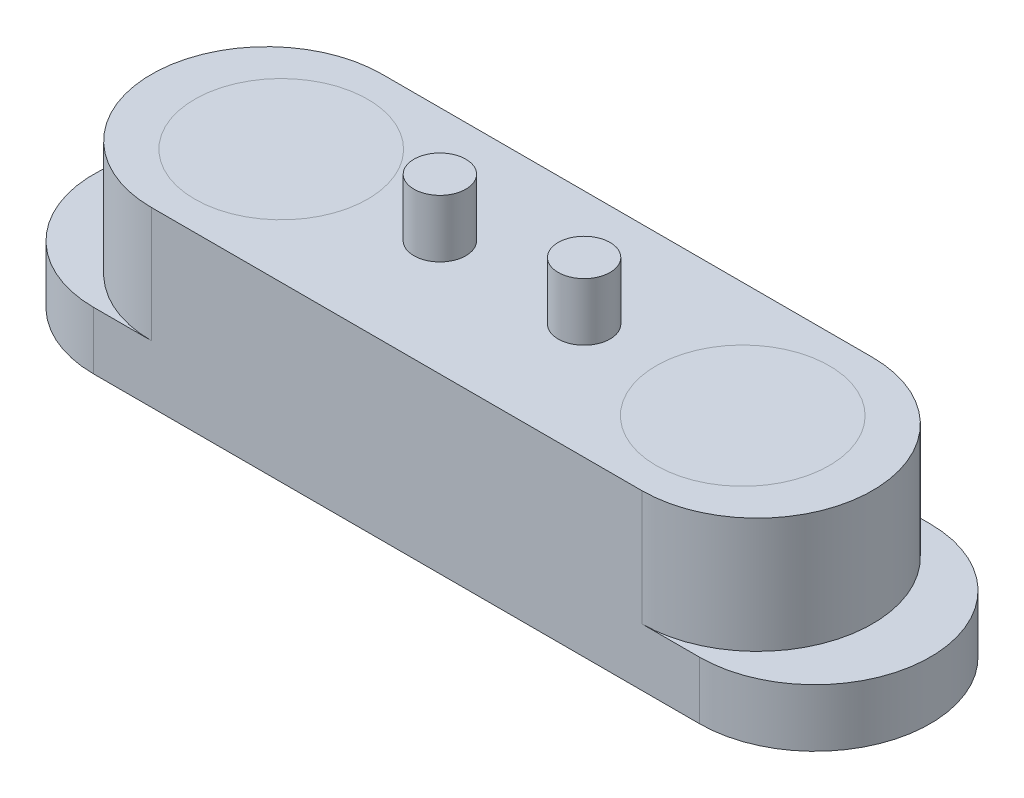
ISO-10303-21;
HEADER;
FILE_DESCRIPTION(('STEP AP214'),'2;1');
FILE_NAME('part.step','',(''),(''),'','','');
FILE_SCHEMA(('AUTOMOTIVE_DESIGN { 1 0 10303 214 1 1 1 1 }'));
ENDSEC;
DATA;
#1=APPLICATION_CONTEXT('core data for automotive mechanical design processes');
#2=APPLICATION_PROTOCOL_DEFINITION('international standard','automotive_design',2000,#1);
#3=PRODUCT_CONTEXT('',#1,'mechanical');
#4=PRODUCT('Part','Part','',(#3));
#5=PRODUCT_RELATED_PRODUCT_CATEGORY('part','',(#4));
#6=PRODUCT_DEFINITION_FORMATION('','',#4);
#7=PRODUCT_DEFINITION_CONTEXT('part definition',#1,'design');
#8=PRODUCT_DEFINITION('design','',#6,#7);
#9=PRODUCT_DEFINITION_SHAPE('','',#8);
#10=(LENGTH_UNIT() NAMED_UNIT(*) SI_UNIT(.MILLI.,.METRE.));
#11=(NAMED_UNIT(*) PLANE_ANGLE_UNIT() SI_UNIT($,.RADIAN.));
#12=(NAMED_UNIT(*) SI_UNIT($,.STERADIAN.) SOLID_ANGLE_UNIT());
#13=UNCERTAINTY_MEASURE_WITH_UNIT(LENGTH_MEASURE(1.E-05),#10,'distance_accuracy_value','');
#14=(GEOMETRIC_REPRESENTATION_CONTEXT(3) GLOBAL_UNCERTAINTY_ASSIGNED_CONTEXT((#13)) GLOBAL_UNIT_ASSIGNED_CONTEXT((#10,
#11,#12)) REPRESENTATION_CONTEXT('',''));
#15=CARTESIAN_POINT('',(0.,0.,0.));
#16=DIRECTION('',(0.,0.,1.));
#17=DIRECTION('',(1.,0.,0.));
#18=AXIS2_PLACEMENT_3D('',#15,#16,#17);
#19=CARTESIAN_POINT('',(9.25,7.24264068711929,0.));
#20=DIRECTION('',(0.,-1.,0.));
#21=DIRECTION('',(0.,0.,-1.));
#22=AXIS2_PLACEMENT_3D('',#19,#20,#21);
#23=CYLINDRICAL_SURFACE('',#22,1.5);
#24=CARTESIAN_POINT('',(9.25,2.,0.));
#25=DIRECTION('',(0.,1.,0.));
#26=DIRECTION('',(0.,0.,1.));
#27=AXIS2_PLACEMENT_3D('',#24,#25,#26);
#28=CIRCLE('',#27,1.5);
#29=CARTESIAN_POINT('',(9.25,2.,1.5));
#30=VERTEX_POINT('',#29);
#31=EDGE_CURVE('E11',#30,#30,#28,.T.);
#32=ORIENTED_EDGE('',*,*,#31,.T.);
#33=EDGE_LOOP('',(#32));
#34=FACE_BOUND('',#33,.T.);
#35=CARTESIAN_POINT('',(9.25,3.,0.));
#36=DIRECTION('',(0.,1.,0.));
#37=DIRECTION('',(0.,0.,1.));
#38=AXIS2_PLACEMENT_3D('',#35,#36,#37);
#39=CIRCLE('',#38,1.5);
#40=CARTESIAN_POINT('',(9.25,3.,1.5));
#41=VERTEX_POINT('',#40);
#42=EDGE_CURVE('E58',#41,#41,#39,.T.);
#43=ORIENTED_EDGE('',*,*,#42,.F.);
#44=EDGE_LOOP('',(#43));
#45=FACE_BOUND('',#44,.T.);
#46=ADVANCED_FACE('F51',(#34,#45),#23,.T.);
#47=CARTESIAN_POINT('',(9.25,2.,0.));
#48=DIRECTION('',(0.,1.,0.));
#49=DIRECTION('',(0.,0.,1.));
#50=AXIS2_PLACEMENT_3D('',#47,#48,#49);
#51=PLANE('',#50);
#52=ORIENTED_EDGE('',*,*,#31,.F.);
#53=EDGE_LOOP('',(#52));
#54=FACE_BOUND('',#53,.T.);
#55=ADVANCED_FACE('F53',(#54),#51,.F.);
#56=CARTESIAN_POINT('',(1.,3.,0.));
#57=DIRECTION('',(0.,1.,0.));
#58=DIRECTION('',(0.,0.,1.));
#59=AXIS2_PLACEMENT_3D('',#56,#57,#58);
#60=PLANE('',#59);
#61=ORIENTED_EDGE('',*,*,#42,.T.);
#62=EDGE_LOOP('',(#61));
#63=FACE_BOUND('',#62,.T.);
#64=ADVANCED_FACE('F64',(#63),#60,.T.);
#65=CLOSED_SHELL('',(#46,#55,#64));
#66=MANIFOLD_SOLID_BREP('B2',#65);
#67=CARTESIAN_POINT('',(1.25,7.24264068711929,0.));
#68=DIRECTION('',(0.,-1.,0.));
#69=DIRECTION('',(0.,0.,-1.));
#70=AXIS2_PLACEMENT_3D('',#67,#68,#69);
#71=CYLINDRICAL_SURFACE('',#70,1.5);
#72=CARTESIAN_POINT('',(1.25,2.,0.));
#73=DIRECTION('',(0.,1.,0.));
#74=DIRECTION('',(0.,0.,1.));
#75=AXIS2_PLACEMENT_3D('',#72,#73,#74);
#76=CIRCLE('',#75,1.5);
#77=CARTESIAN_POINT('',(1.25,2.,1.5));
#78=VERTEX_POINT('',#77);
#79=EDGE_CURVE('E119',#78,#78,#76,.T.);
#80=ORIENTED_EDGE('',*,*,#79,.T.);
#81=EDGE_LOOP('',(#80));
#82=FACE_BOUND('',#81,.T.);
#83=CARTESIAN_POINT('',(1.25,3.,0.));
#84=DIRECTION('',(0.,1.,0.));
#85=DIRECTION('',(0.,0.,1.));
#86=AXIS2_PLACEMENT_3D('',#83,#84,#85);
#87=CIRCLE('',#86,1.5);
#88=CARTESIAN_POINT('',(1.25,3.,1.5));
#89=VERTEX_POINT('',#88);
#90=EDGE_CURVE('E50',#89,#89,#87,.T.);
#91=ORIENTED_EDGE('',*,*,#90,.F.);
#92=EDGE_LOOP('',(#91));
#93=FACE_BOUND('',#92,.T.);
#94=ADVANCED_FACE('F112',(#82,#93),#71,.T.);
#95=CARTESIAN_POINT('',(1.25,2.,0.));
#96=DIRECTION('',(0.,1.,0.));
#97=DIRECTION('',(0.,0.,1.));
#98=AXIS2_PLACEMENT_3D('',#95,#96,#97);
#99=PLANE('',#98);
#100=ORIENTED_EDGE('',*,*,#79,.F.);
#101=EDGE_LOOP('',(#100));
#102=FACE_BOUND('',#101,.T.);
#103=ADVANCED_FACE('F127',(#102),#99,.F.);
#104=CARTESIAN_POINT('',(1.,3.,0.));
#105=DIRECTION('',(0.,1.,0.));
#106=DIRECTION('',(0.,0.,1.));
#107=AXIS2_PLACEMENT_3D('',#104,#105,#106);
#108=PLANE('',#107);
#109=ORIENTED_EDGE('',*,*,#90,.T.);
#110=EDGE_LOOP('',(#109));
#111=FACE_BOUND('',#110,.T.);
#112=ADVANCED_FACE('F114',(#111),#108,.T.);
#113=CLOSED_SHELL('',(#94,#103,#112));
#114=MANIFOLD_SOLID_BREP('B6',#113);
#115=CARTESIAN_POINT('',(0.,1.,0.));
#116=DIRECTION('',(0.,1.,0.));
#117=DIRECTION('',(0.,0.,1.));
#118=AXIS2_PLACEMENT_3D('',#115,#116,#117);
#119=PLANE('',#118);
#120=CARTESIAN_POINT('',(1.,1.,0.));
#121=DIRECTION('',(0.,1.,0.));
#122=DIRECTION('',(0.,0.,1.));
#123=AXIS2_PLACEMENT_3D('',#120,#121,#122);
#124=CIRCLE('',#123,2.);
#125=CARTESIAN_POINT('',(1.,1.,-2.));
#126=VERTEX_POINT('',#125);
#127=CARTESIAN_POINT('',(1.,1.,2.));
#128=VERTEX_POINT('',#127);
#129=EDGE_CURVE('E179',#126,#128,#124,.T.);
#130=ORIENTED_EDGE('',*,*,#129,.F.);
#131=DIRECTION('',(-1.,0.,0.));
#132=VECTOR('',#131,1.);
#133=CARTESIAN_POINT('',(0.,1.,-2.));
#134=LINE('',#133,#132);
#135=CARTESIAN_POINT('',(0.,1.,-2.));
#136=VERTEX_POINT('',#135);
#137=EDGE_CURVE('E268',#126,#136,#134,.T.);
#138=ORIENTED_EDGE('',*,*,#137,.T.);
#139=CARTESIAN_POINT('',(0.,1.,0.));
#140=DIRECTION('',(0.,1.,0.));
#141=DIRECTION('',(0.,0.,1.));
#142=AXIS2_PLACEMENT_3D('',#139,#140,#141);
#143=CIRCLE('',#142,2.);
#144=CARTESIAN_POINT('',(0.,1.,2.));
#145=VERTEX_POINT('',#144);
#146=EDGE_CURVE('E259',#136,#145,#143,.T.);
#147=ORIENTED_EDGE('',*,*,#146,.T.);
#148=DIRECTION('',(1.,0.,0.));
#149=VECTOR('',#148,1.);
#150=CARTESIAN_POINT('',(0.,1.,2.));
#151=LINE('',#150,#149);
#152=EDGE_CURVE('E264',#145,#128,#151,.T.);
#153=ORIENTED_EDGE('',*,*,#152,.T.);
#154=EDGE_LOOP('',(#130,#138,#147,#153));
#155=FACE_BOUND('',#154,.T.);
#156=ADVANCED_FACE('F164',(#155),#119,.T.);
#157=CARTESIAN_POINT('',(0.,1.,0.));
#158=DIRECTION('',(0.,-1.,0.));
#159=DIRECTION('',(0.,0.,-1.));
#160=AXIS2_PLACEMENT_3D('',#157,#158,#159);
#161=CYLINDRICAL_SURFACE('',#160,2.);
#162=CARTESIAN_POINT('',(0.,0.,0.));
#163=DIRECTION('',(0.,1.,0.));
#164=DIRECTION('',(0.,0.,1.));
#165=AXIS2_PLACEMENT_3D('',#162,#163,#164);
#166=CIRCLE('',#165,2.);
#167=CARTESIAN_POINT('',(0.,0.,-2.));
#168=VERTEX_POINT('',#167);
#169=CARTESIAN_POINT('',(0.,0.,2.));
#170=VERTEX_POINT('',#169);
#171=EDGE_CURVE('E250',#168,#170,#166,.T.);
#172=ORIENTED_EDGE('',*,*,#171,.T.);
#173=DIRECTION('',(0.,-1.,0.));
#174=VECTOR('',#173,1.);
#175=CARTESIAN_POINT('',(0.,1.,2.));
#176=LINE('',#175,#174);
#177=EDGE_CURVE('E110',#145,#170,#176,.T.);
#178=ORIENTED_EDGE('',*,*,#177,.F.);
#179=ORIENTED_EDGE('',*,*,#146,.F.);
#180=DIRECTION('',(0.,-1.,0.));
#181=VECTOR('',#180,1.);
#182=CARTESIAN_POINT('',(0.,1.,-2.));
#183=LINE('',#182,#181);
#184=EDGE_CURVE('E270',#136,#168,#183,.T.);
#185=ORIENTED_EDGE('',*,*,#184,.T.);
#186=EDGE_LOOP('',(#172,#178,#179,#185));
#187=FACE_BOUND('',#186,.T.);
#188=ADVANCED_FACE('F166',(#187),#161,.T.);
#189=CARTESIAN_POINT('',(0.,1.,2.));
#190=DIRECTION('',(0.,0.,-1.));
#191=DIRECTION('',(-1.,0.,0.));
#192=AXIS2_PLACEMENT_3D('',#189,#190,#191);
#193=PLANE('',#192);
#194=DIRECTION('',(1.,0.,0.));
#195=VECTOR('',#194,1.);
#196=CARTESIAN_POINT('',(0.,0.,2.));
#197=LINE('',#196,#195);
#198=CARTESIAN_POINT('',(10.5,0.,2.));
#199=VERTEX_POINT('',#198);
#200=EDGE_CURVE('E253',#170,#199,#197,.T.);
#201=ORIENTED_EDGE('',*,*,#200,.T.);
#202=DIRECTION('',(0.,-1.,0.));
#203=VECTOR('',#202,1.);
#204=CARTESIAN_POINT('',(10.5,1.,2.));
#205=LINE('',#204,#203);
#206=CARTESIAN_POINT('',(10.5,1.,2.));
#207=VERTEX_POINT('',#206);
#208=EDGE_CURVE('E172',#207,#199,#205,.T.);
#209=ORIENTED_EDGE('',*,*,#208,.F.);
#210=CARTESIAN_POINT('',(9.5,1.,2.));
#211=VERTEX_POINT('',#210);
#212=EDGE_CURVE('E262',#211,#207,#151,.T.);
#213=ORIENTED_EDGE('',*,*,#212,.F.);
#214=DIRECTION('',(0.,-1.,0.));
#215=VECTOR('',#214,1.);
#216=CARTESIAN_POINT('',(9.5,3.,2.));
#217=LINE('',#216,#215);
#218=CARTESIAN_POINT('',(9.5,3.,2.));
#219=VERTEX_POINT('',#218);
#220=EDGE_CURVE('E235',#219,#211,#217,.T.);
#221=ORIENTED_EDGE('',*,*,#220,.F.);
#222=DIRECTION('',(1.,0.,0.));
#223=VECTOR('',#222,1.);
#224=CARTESIAN_POINT('',(1.,3.,2.));
#225=LINE('',#224,#223);
#226=CARTESIAN_POINT('',(1.,3.,2.));
#227=VERTEX_POINT('',#226);
#228=EDGE_CURVE('E229',#227,#219,#225,.T.);
#229=ORIENTED_EDGE('',*,*,#228,.F.);
#230=DIRECTION('',(0.,-1.,0.));
#231=VECTOR('',#230,1.);
#232=CARTESIAN_POINT('',(1.,3.,2.));
#233=LINE('',#232,#231);
#234=EDGE_CURVE('E233',#227,#128,#233,.T.);
#235=ORIENTED_EDGE('',*,*,#234,.T.);
#236=ORIENTED_EDGE('',*,*,#152,.F.);
#237=ORIENTED_EDGE('',*,*,#177,.T.);
#238=EDGE_LOOP('',(#201,#209,#213,#221,#229,#235,#236,#237));
#239=FACE_BOUND('',#238,.T.);
#240=ADVANCED_FACE('F231',(#239),#193,.F.);
#241=CARTESIAN_POINT('',(10.5,1.,0.));
#242=DIRECTION('',(0.,-1.,0.));
#243=DIRECTION('',(0.,0.,-1.));
#244=AXIS2_PLACEMENT_3D('',#241,#242,#243);
#245=CYLINDRICAL_SURFACE('',#244,2.);
#246=CARTESIAN_POINT('',(10.5,0.,0.));
#247=DIRECTION('',(0.,1.,0.));
#248=DIRECTION('',(0.,0.,1.));
#249=AXIS2_PLACEMENT_3D('',#246,#247,#248);
#250=CIRCLE('',#249,2.);
#251=CARTESIAN_POINT('',(10.5,0.,-2.));
#252=VERTEX_POINT('',#251);
#253=EDGE_CURVE('E273',#199,#252,#250,.T.);
#254=ORIENTED_EDGE('',*,*,#253,.T.);
#255=DIRECTION('',(0.,-1.,0.));
#256=VECTOR('',#255,1.);
#257=CARTESIAN_POINT('',(10.5,1.,-2.));
#258=LINE('',#257,#256);
#259=CARTESIAN_POINT('',(10.5,1.,-2.));
#260=VERTEX_POINT('',#259);
#261=EDGE_CURVE('E278',#260,#252,#258,.T.);
#262=ORIENTED_EDGE('',*,*,#261,.F.);
#263=CARTESIAN_POINT('',(10.5,1.,0.));
#264=DIRECTION('',(0.,1.,0.));
#265=DIRECTION('',(0.,0.,1.));
#266=AXIS2_PLACEMENT_3D('',#263,#264,#265);
#267=CIRCLE('',#266,2.);
#268=EDGE_CURVE('E266',#207,#260,#267,.T.);
#269=ORIENTED_EDGE('',*,*,#268,.F.);
#270=ORIENTED_EDGE('',*,*,#208,.T.);
#271=EDGE_LOOP('',(#254,#262,#269,#270));
#272=FACE_BOUND('',#271,.T.);
#273=ADVANCED_FACE('F285',(#272),#245,.T.);
#274=CARTESIAN_POINT('',(0.,1.,-2.));
#275=DIRECTION('',(0.,0.,1.));
#276=DIRECTION('',(1.,0.,0.));
#277=AXIS2_PLACEMENT_3D('',#274,#275,#276);
#278=PLANE('',#277);
#279=DIRECTION('',(-1.,0.,0.));
#280=VECTOR('',#279,1.);
#281=CARTESIAN_POINT('',(0.,0.,-2.));
#282=LINE('',#281,#280);
#283=EDGE_CURVE('E263',#252,#168,#282,.T.);
#284=ORIENTED_EDGE('',*,*,#283,.T.);
#285=ORIENTED_EDGE('',*,*,#184,.F.);
#286=ORIENTED_EDGE('',*,*,#137,.F.);
#287=DIRECTION('',(0.,-1.,0.));
#288=VECTOR('',#287,1.);
#289=CARTESIAN_POINT('',(1.,3.,-2.));
#290=LINE('',#289,#288);
#291=CARTESIAN_POINT('',(1.,3.,-2.));
#292=VERTEX_POINT('',#291);
#293=EDGE_CURVE('E298',#292,#126,#290,.T.);
#294=ORIENTED_EDGE('',*,*,#293,.F.);
#295=DIRECTION('',(-1.,0.,0.));
#296=VECTOR('',#295,1.);
#297=CARTESIAN_POINT('',(1.,3.,-2.));
#298=LINE('',#297,#296);
#299=CARTESIAN_POINT('',(9.5,3.,-2.));
#300=VERTEX_POINT('',#299);
#301=EDGE_CURVE('E244',#300,#292,#298,.T.);
#302=ORIENTED_EDGE('',*,*,#301,.F.);
#303=DIRECTION('',(0.,-1.,0.));
#304=VECTOR('',#303,1.);
#305=CARTESIAN_POINT('',(9.5,3.,-2.));
#306=LINE('',#305,#304);
#307=CARTESIAN_POINT('',(9.5,1.,-2.));
#308=VERTEX_POINT('',#307);
#309=EDGE_CURVE('E255',#300,#308,#306,.T.);
#310=ORIENTED_EDGE('',*,*,#309,.T.);
#311=EDGE_CURVE('E269',#260,#308,#134,.T.);
#312=ORIENTED_EDGE('',*,*,#311,.F.);
#313=ORIENTED_EDGE('',*,*,#261,.T.);
#314=EDGE_LOOP('',(#284,#285,#286,#294,#302,#310,#312,#313));
#315=FACE_BOUND('',#314,.T.);
#316=ADVANCED_FACE('F293',(#315),#278,.F.);
#317=CARTESIAN_POINT('',(9.5,1.,0.));
#318=DIRECTION('',(0.,1.,0.));
#319=DIRECTION('',(0.,0.,1.));
#320=AXIS2_PLACEMENT_3D('',#317,#318,#319);
#321=CIRCLE('',#320,2.);
#322=EDGE_CURVE('E187',#211,#308,#321,.T.);
#323=ORIENTED_EDGE('',*,*,#322,.F.);
#324=ORIENTED_EDGE('',*,*,#212,.T.);
#325=ORIENTED_EDGE('',*,*,#268,.T.);
#326=ORIENTED_EDGE('',*,*,#311,.T.);
#327=EDGE_LOOP('',(#323,#324,#325,#326));
#328=FACE_BOUND('',#327,.T.);
#329=ADVANCED_FACE('F349',(#328),#119,.T.);
#330=CARTESIAN_POINT('',(0.,0.,0.));
#331=DIRECTION('',(0.,1.,0.));
#332=DIRECTION('',(0.,0.,1.));
#333=AXIS2_PLACEMENT_3D('',#330,#331,#332);
#334=PLANE('',#333);
#335=ORIENTED_EDGE('',*,*,#171,.F.);
#336=ORIENTED_EDGE('',*,*,#283,.F.);
#337=ORIENTED_EDGE('',*,*,#253,.F.);
#338=ORIENTED_EDGE('',*,*,#200,.F.);
#339=EDGE_LOOP('',(#335,#336,#337,#338));
#340=FACE_BOUND('',#339,.T.);
#341=ADVANCED_FACE('F290',(#340),#334,.F.);
#342=CARTESIAN_POINT('',(1.,3.,0.));
#343=DIRECTION('',(0.,-1.,0.));
#344=DIRECTION('',(0.,0.,-1.));
#345=AXIS2_PLACEMENT_3D('',#342,#343,#344);
#346=CYLINDRICAL_SURFACE('',#345,2.);
#347=ORIENTED_EDGE('',*,*,#129,.T.);
#348=ORIENTED_EDGE('',*,*,#234,.F.);
#349=CARTESIAN_POINT('',(1.,3.,0.));
#350=DIRECTION('',(0.,1.,0.));
#351=DIRECTION('',(0.,0.,1.));
#352=AXIS2_PLACEMENT_3D('',#349,#350,#351);
#353=CIRCLE('',#352,2.);
#354=EDGE_CURVE('E239',#292,#227,#353,.T.);
#355=ORIENTED_EDGE('',*,*,#354,.F.);
#356=ORIENTED_EDGE('',*,*,#293,.T.);
#357=EDGE_LOOP('',(#347,#348,#355,#356));
#358=FACE_BOUND('',#357,.T.);
#359=ADVANCED_FACE('F249',(#358),#346,.T.);
#360=CARTESIAN_POINT('',(9.5,3.,0.));
#361=DIRECTION('',(0.,-1.,0.));
#362=DIRECTION('',(0.,0.,-1.));
#363=AXIS2_PLACEMENT_3D('',#360,#361,#362);
#364=CYLINDRICAL_SURFACE('',#363,2.);
#365=ORIENTED_EDGE('',*,*,#322,.T.);
#366=ORIENTED_EDGE('',*,*,#309,.F.);
#367=CARTESIAN_POINT('',(9.5,3.,0.));
#368=DIRECTION('',(0.,1.,0.));
#369=DIRECTION('',(0.,0.,1.));
#370=AXIS2_PLACEMENT_3D('',#367,#368,#369);
#371=CIRCLE('',#370,2.);
#372=EDGE_CURVE('E238',#219,#300,#371,.T.);
#373=ORIENTED_EDGE('',*,*,#372,.F.);
#374=ORIENTED_EDGE('',*,*,#220,.T.);
#375=EDGE_LOOP('',(#365,#366,#373,#374));
#376=FACE_BOUND('',#375,.T.);
#377=ADVANCED_FACE('F400',(#376),#364,.T.);
#378=CARTESIAN_POINT('',(1.,3.,0.));
#379=DIRECTION('',(0.,1.,0.));
#380=DIRECTION('',(0.,0.,1.));
#381=AXIS2_PLACEMENT_3D('',#378,#379,#380);
#382=PLANE('',#381);
#383=CARTESIAN_POINT('',(1.25,3.,0.));
#384=DIRECTION('',(0.,1.,0.));
#385=DIRECTION('',(0.,0.,1.));
#386=AXIS2_PLACEMENT_3D('',#383,#384,#385);
#387=CIRCLE('',#386,1.5);
#388=CARTESIAN_POINT('',(1.25,3.,1.5));
#389=VERTEX_POINT('',#388);
#390=EDGE_CURVE('E317',#389,#389,#387,.T.);
#391=ORIENTED_EDGE('',*,*,#390,.F.);
#392=EDGE_LOOP('',(#391));
#393=FACE_BOUND('',#392,.T.);
#394=CARTESIAN_POINT('',(6.5,3.,0.));
#395=DIRECTION('',(0.,1.,0.));
#396=DIRECTION('',(0.,0.,1.));
#397=AXIS2_PLACEMENT_3D('',#394,#395,#396);
#398=CIRCLE('',#397,0.45);
#399=CARTESIAN_POINT('',(6.5,3.,0.45));
#400=VERTEX_POINT('',#399);
#401=EDGE_CURVE('E311',#400,#400,#398,.T.);
#402=ORIENTED_EDGE('',*,*,#401,.F.);
#403=EDGE_LOOP('',(#402));
#404=FACE_BOUND('',#403,.T.);
#405=CARTESIAN_POINT('',(4.,3.,0.));
#406=DIRECTION('',(0.,1.,0.));
#407=DIRECTION('',(0.,0.,1.));
#408=AXIS2_PLACEMENT_3D('',#405,#406,#407);
#409=CIRCLE('',#408,0.45);
#410=CARTESIAN_POINT('',(4.,3.,0.45));
#411=VERTEX_POINT('',#410);
#412=EDGE_CURVE('E307',#411,#411,#409,.T.);
#413=ORIENTED_EDGE('',*,*,#412,.F.);
#414=EDGE_LOOP('',(#413));
#415=FACE_BOUND('',#414,.T.);
#416=CARTESIAN_POINT('',(9.25,3.,0.));
#417=DIRECTION('',(0.,1.,0.));
#418=DIRECTION('',(0.,0.,1.));
#419=AXIS2_PLACEMENT_3D('',#416,#417,#418);
#420=CIRCLE('',#419,1.5);
#421=CARTESIAN_POINT('',(9.25,3.,1.5));
#422=VERTEX_POINT('',#421);
#423=EDGE_CURVE('E314',#422,#422,#420,.T.);
#424=ORIENTED_EDGE('',*,*,#423,.F.);
#425=EDGE_LOOP('',(#424));
#426=FACE_BOUND('',#425,.T.);
#427=ORIENTED_EDGE('',*,*,#354,.T.);
#428=ORIENTED_EDGE('',*,*,#228,.T.);
#429=ORIENTED_EDGE('',*,*,#372,.T.);
#430=ORIENTED_EDGE('',*,*,#301,.T.);
#431=EDGE_LOOP('',(#427,#428,#429,#430));
#432=FACE_BOUND('',#431,.T.);
#433=ADVANCED_FACE('F242',(#393,#404,#415,#426,#432),#382,.T.);
#434=CARTESIAN_POINT('',(9.25,2.,0.));
#435=DIRECTION('',(0.,1.,0.));
#436=DIRECTION('',(0.,0.,1.));
#437=AXIS2_PLACEMENT_3D('',#434,#435,#436);
#438=CYLINDRICAL_SURFACE('',#437,1.5);
#439=CARTESIAN_POINT('',(9.25,2.,0.));
#440=DIRECTION('',(0.,1.,0.));
#441=DIRECTION('',(0.,0.,1.));
#442=AXIS2_PLACEMENT_3D('',#439,#440,#441);
#443=CIRCLE('',#442,1.5);
#444=CARTESIAN_POINT('',(9.25,2.,1.5));
#445=VERTEX_POINT('',#444);
#446=EDGE_CURVE('E310',#445,#445,#443,.T.);
#447=ORIENTED_EDGE('',*,*,#446,.F.);
#448=EDGE_LOOP('',(#447));
#449=FACE_BOUND('',#448,.T.);
#450=ORIENTED_EDGE('',*,*,#423,.T.);
#451=EDGE_LOOP('',(#450));
#452=FACE_BOUND('',#451,.T.);
#453=ADVANCED_FACE('F416',(#449,#452),#438,.F.);
#454=CARTESIAN_POINT('',(9.25,2.,0.));
#455=DIRECTION('',(0.,1.,0.));
#456=DIRECTION('',(0.,0.,1.));
#457=AXIS2_PLACEMENT_3D('',#454,#455,#456);
#458=PLANE('',#457);
#459=ORIENTED_EDGE('',*,*,#446,.T.);
#460=EDGE_LOOP('',(#459));
#461=FACE_BOUND('',#460,.T.);
#462=ADVANCED_FACE('F426',(#461),#458,.T.);
#463=CARTESIAN_POINT('',(1.25,2.,0.));
#464=DIRECTION('',(0.,1.,0.));
#465=DIRECTION('',(0.,0.,1.));
#466=AXIS2_PLACEMENT_3D('',#463,#464,#465);
#467=CYLINDRICAL_SURFACE('',#466,1.5);
#468=CARTESIAN_POINT('',(1.25,2.,0.));
#469=DIRECTION('',(0.,1.,0.));
#470=DIRECTION('',(0.,0.,1.));
#471=AXIS2_PLACEMENT_3D('',#468,#469,#470);
#472=CIRCLE('',#471,1.5);
#473=CARTESIAN_POINT('',(1.25,2.,1.5));
#474=VERTEX_POINT('',#473);
#475=EDGE_CURVE('E304',#474,#474,#472,.T.);
#476=ORIENTED_EDGE('',*,*,#475,.F.);
#477=EDGE_LOOP('',(#476));
#478=FACE_BOUND('',#477,.T.);
#479=ORIENTED_EDGE('',*,*,#390,.T.);
#480=EDGE_LOOP('',(#479));
#481=FACE_BOUND('',#480,.T.);
#482=ADVANCED_FACE('F436',(#478,#481),#467,.F.);
#483=CARTESIAN_POINT('',(1.25,2.,0.));
#484=DIRECTION('',(0.,1.,0.));
#485=DIRECTION('',(0.,0.,1.));
#486=AXIS2_PLACEMENT_3D('',#483,#484,#485);
#487=PLANE('',#486);
#488=ORIENTED_EDGE('',*,*,#475,.T.);
#489=EDGE_LOOP('',(#488));
#490=FACE_BOUND('',#489,.T.);
#491=ADVANCED_FACE('F446',(#490),#487,.T.);
#492=CARTESIAN_POINT('',(6.5,4.,0.));
#493=DIRECTION('',(0.,-1.,0.));
#494=DIRECTION('',(0.,0.,-1.));
#495=AXIS2_PLACEMENT_3D('',#492,#493,#494);
#496=CYLINDRICAL_SURFACE('',#495,0.45);
#497=ORIENTED_EDGE('',*,*,#401,.T.);
#498=EDGE_LOOP('',(#497));
#499=FACE_BOUND('',#498,.T.);
#500=CARTESIAN_POINT('',(6.5,4.,0.));
#501=DIRECTION('',(0.,1.,0.));
#502=DIRECTION('',(0.,0.,1.));
#503=AXIS2_PLACEMENT_3D('',#500,#501,#502);
#504=CIRCLE('',#503,0.45);
#505=CARTESIAN_POINT('',(6.5,4.,0.45));
#506=VERTEX_POINT('',#505);
#507=EDGE_CURVE('E325',#506,#506,#504,.T.);
#508=ORIENTED_EDGE('',*,*,#507,.F.);
#509=EDGE_LOOP('',(#508));
#510=FACE_BOUND('',#509,.T.);
#511=ADVANCED_FACE('F343',(#499,#510),#496,.T.);
#512=CARTESIAN_POINT('',(6.5,4.,0.));
#513=DIRECTION('',(0.,1.,0.));
#514=DIRECTION('',(0.,0.,1.));
#515=AXIS2_PLACEMENT_3D('',#512,#513,#514);
#516=PLANE('',#515);
#517=ORIENTED_EDGE('',*,*,#507,.T.);
#518=EDGE_LOOP('',(#517));
#519=FACE_BOUND('',#518,.T.);
#520=ADVANCED_FACE('F335',(#519),#516,.T.);
#521=CARTESIAN_POINT('',(4.,4.,0.));
#522=DIRECTION('',(0.,-1.,0.));
#523=DIRECTION('',(0.,0.,-1.));
#524=AXIS2_PLACEMENT_3D('',#521,#522,#523);
#525=CYLINDRICAL_SURFACE('',#524,0.45);
#526=ORIENTED_EDGE('',*,*,#412,.T.);
#527=EDGE_LOOP('',(#526));
#528=FACE_BOUND('',#527,.T.);
#529=CARTESIAN_POINT('',(4.,4.,0.));
#530=DIRECTION('',(0.,1.,0.));
#531=DIRECTION('',(0.,0.,1.));
#532=AXIS2_PLACEMENT_3D('',#529,#530,#531);
#533=CIRCLE('',#532,0.45);
#534=CARTESIAN_POINT('',(4.,4.,0.45));
#535=VERTEX_POINT('',#534);
#536=EDGE_CURVE('E320',#535,#535,#533,.T.);
#537=ORIENTED_EDGE('',*,*,#536,.F.);
#538=EDGE_LOOP('',(#537));
#539=FACE_BOUND('',#538,.T.);
#540=ADVANCED_FACE('F333',(#528,#539),#525,.T.);
#541=CARTESIAN_POINT('',(4.,4.,0.));
#542=DIRECTION('',(0.,1.,0.));
#543=DIRECTION('',(0.,0.,1.));
#544=AXIS2_PLACEMENT_3D('',#541,#542,#543);
#545=PLANE('',#544);
#546=ORIENTED_EDGE('',*,*,#536,.T.);
#547=EDGE_LOOP('',(#546));
#548=FACE_BOUND('',#547,.T.);
#549=ADVANCED_FACE('F331',(#548),#545,.T.);
#550=CLOSED_SHELL('',(#156,#188,#240,#273,#316,#329,#341,#359,#377,#433,#453,#462,#482,#491,
#511,#520,#540,#549));
#551=MANIFOLD_SOLID_BREP('B45',#550);
#552=ADVANCED_BREP_SHAPE_REPRESENTATION('',(#18,#66,#114,#551),#14);
#553=SHAPE_DEFINITION_REPRESENTATION(#9,#552);
ENDSEC;
END-ISO-10303-21;
